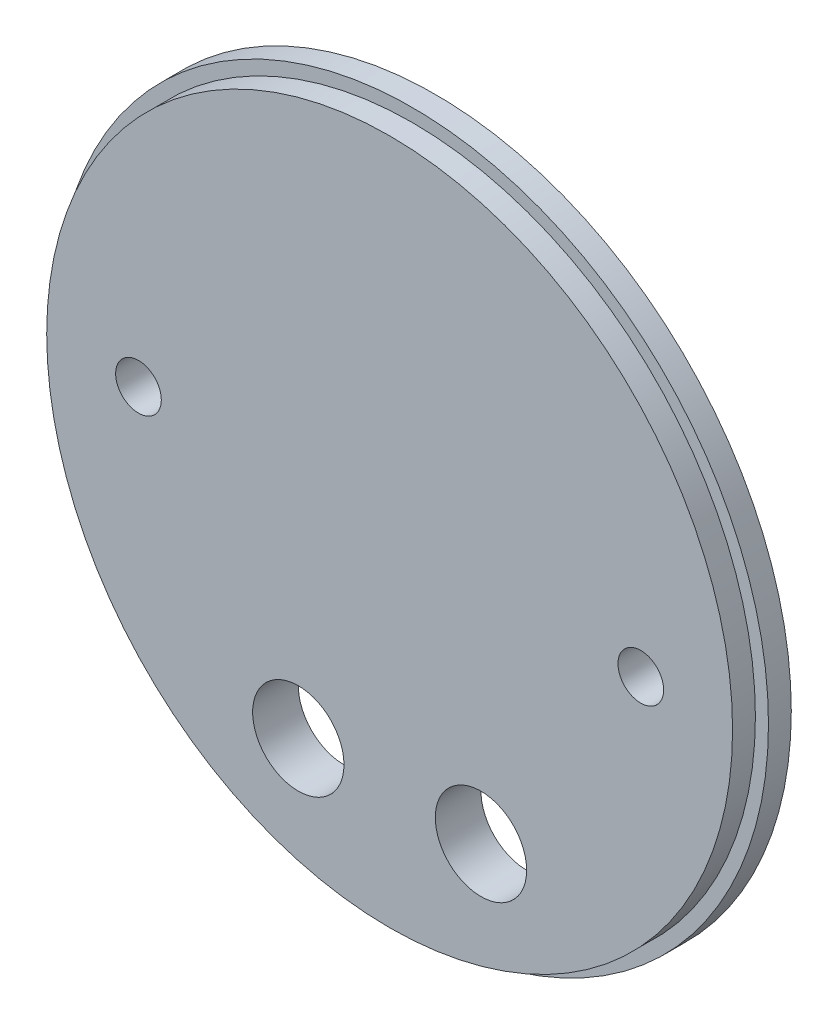
ISO-10303-21;
HEADER;
FILE_DESCRIPTION(('STEP AP214'),'2;1');
FILE_NAME('part.step','',(''),(''),'','','');
FILE_SCHEMA(('AUTOMOTIVE_DESIGN { 1 0 10303 214 1 1 1 1 }'));
ENDSEC;
DATA;
#1=APPLICATION_CONTEXT('core data for automotive mechanical design processes');
#2=APPLICATION_PROTOCOL_DEFINITION('international standard','automotive_design',2000,#1);
#3=PRODUCT_CONTEXT('',#1,'mechanical');
#4=PRODUCT('Part','Part','',(#3));
#5=PRODUCT_RELATED_PRODUCT_CATEGORY('part','',(#4));
#6=PRODUCT_DEFINITION_FORMATION('','',#4);
#7=PRODUCT_DEFINITION_CONTEXT('part definition',#1,'design');
#8=PRODUCT_DEFINITION('design','',#6,#7);
#9=PRODUCT_DEFINITION_SHAPE('','',#8);
#10=(LENGTH_UNIT() NAMED_UNIT(*) SI_UNIT(.MILLI.,.METRE.));
#11=(NAMED_UNIT(*) PLANE_ANGLE_UNIT() SI_UNIT($,.RADIAN.));
#12=(NAMED_UNIT(*) SI_UNIT($,.STERADIAN.) SOLID_ANGLE_UNIT());
#13=UNCERTAINTY_MEASURE_WITH_UNIT(LENGTH_MEASURE(1.E-05),#10,'distance_accuracy_value','');
#14=(GEOMETRIC_REPRESENTATION_CONTEXT(3) GLOBAL_UNCERTAINTY_ASSIGNED_CONTEXT((#13)) GLOBAL_UNIT_ASSIGNED_CONTEXT((#10,
#11,#12)) REPRESENTATION_CONTEXT('',''));
#15=CARTESIAN_POINT('',(0.,0.,0.));
#16=DIRECTION('',(0.,0.,1.));
#17=DIRECTION('',(1.,0.,0.));
#18=AXIS2_PLACEMENT_3D('',#15,#16,#17);
#19=CARTESIAN_POINT('',(0.,0.,3.175));
#20=DIRECTION('',(0.,0.,-1.));
#21=DIRECTION('',(-1.,0.,0.));
#22=AXIS2_PLACEMENT_3D('',#19,#20,#21);
#23=CYLINDRICAL_SURFACE('',#22,49.5046);
#24=CARTESIAN_POINT('',(0.,0.,3.175));
#25=DIRECTION('',(0.,0.,1.));
#26=DIRECTION('',(1.,0.,0.));
#27=AXIS2_PLACEMENT_3D('',#24,#25,#26);
#28=CIRCLE('',#27,49.5046);
#29=CARTESIAN_POINT('',(49.5046,0.,3.175));
#30=VERTEX_POINT('',#29);
#31=EDGE_CURVE('E42',#30,#30,#28,.T.);
#32=ORIENTED_EDGE('',*,*,#31,.F.);
#33=EDGE_LOOP('',(#32));
#34=FACE_BOUND('',#33,.T.);
#35=CARTESIAN_POINT('',(0.,0.,0.));
#36=DIRECTION('',(0.,0.,1.));
#37=DIRECTION('',(1.,0.,0.));
#38=AXIS2_PLACEMENT_3D('',#35,#36,#37);
#39=CIRCLE('',#38,49.5046);
#40=CARTESIAN_POINT('',(49.5046,0.,0.));
#41=VERTEX_POINT('',#40);
#42=EDGE_CURVE('E38',#41,#41,#39,.T.);
#43=ORIENTED_EDGE('',*,*,#42,.T.);
#44=EDGE_LOOP('',(#43));
#45=FACE_BOUND('',#44,.T.);
#46=ADVANCED_FACE('F35',(#34,#45),#23,.T.);
#47=CARTESIAN_POINT('',(0.,0.,3.175));
#48=DIRECTION('',(0.,0.,1.));
#49=DIRECTION('',(1.,0.,0.));
#50=AXIS2_PLACEMENT_3D('',#47,#48,#49);
#51=PLANE('',#50);
#52=CARTESIAN_POINT('',(0.,0.,3.175));
#53=DIRECTION('',(0.,0.,1.));
#54=DIRECTION('',(1.,0.,0.));
#55=AXIS2_PLACEMENT_3D('',#52,#53,#54);
#56=CIRCLE('',#55,47.6885);
#57=CARTESIAN_POINT('',(47.6885,0.,3.175));
#58=VERTEX_POINT('',#57);
#59=EDGE_CURVE('E10',#58,#58,#56,.T.);
#60=ORIENTED_EDGE('',*,*,#59,.F.);
#61=EDGE_LOOP('',(#60));
#62=FACE_BOUND('',#61,.T.);
#63=ORIENTED_EDGE('',*,*,#31,.T.);
#64=EDGE_LOOP('',(#63));
#65=FACE_BOUND('',#64,.T.);
#66=ADVANCED_FACE('F102',(#62,#65),#51,.T.);
#67=CARTESIAN_POINT('',(0.,0.,0.));
#68=DIRECTION('',(0.,0.,1.));
#69=DIRECTION('',(1.,0.,0.));
#70=AXIS2_PLACEMENT_3D('',#67,#68,#69);
#71=PLANE('',#70);
#72=CARTESIAN_POINT('',(34.925,0.,0.));
#73=DIRECTION('',(0.,0.,1.));
#74=DIRECTION('',(1.,0.,0.));
#75=AXIS2_PLACEMENT_3D('',#72,#73,#74);
#76=CIRCLE('',#75,3.175);
#77=CARTESIAN_POINT('',(38.1,0.,0.));
#78=VERTEX_POINT('',#77);
#79=EDGE_CURVE('E61',#78,#78,#76,.T.);
#80=ORIENTED_EDGE('',*,*,#79,.T.);
#81=EDGE_LOOP('',(#80));
#82=FACE_BOUND('',#81,.T.);
#83=CARTESIAN_POINT('',(-34.925,0.,0.));
#84=DIRECTION('',(0.,0.,1.));
#85=DIRECTION('',(1.,0.,0.));
#86=AXIS2_PLACEMENT_3D('',#83,#84,#85);
#87=CIRCLE('',#86,3.17500000000001);
#88=CARTESIAN_POINT('',(-31.75,0.,0.));
#89=VERTEX_POINT('',#88);
#90=EDGE_CURVE('E67',#89,#89,#87,.T.);
#91=ORIENTED_EDGE('',*,*,#90,.T.);
#92=EDGE_LOOP('',(#91));
#93=FACE_BOUND('',#92,.T.);
#94=CARTESIAN_POINT('',(12.7,-31.2353524431853,0.));
#95=DIRECTION('',(0.,0.,1.));
#96=DIRECTION('',(1.,0.,0.));
#97=AXIS2_PLACEMENT_3D('',#94,#95,#96);
#98=CIRCLE('',#97,6.35);
#99=CARTESIAN_POINT('',(19.05,-31.2353524431853,0.));
#100=VERTEX_POINT('',#99);
#101=EDGE_CURVE('E55',#100,#100,#98,.T.);
#102=ORIENTED_EDGE('',*,*,#101,.T.);
#103=EDGE_LOOP('',(#102));
#104=FACE_BOUND('',#103,.T.);
#105=CARTESIAN_POINT('',(-12.7,-31.2353524431853,0.));
#106=DIRECTION('',(0.,0.,1.));
#107=DIRECTION('',(1.,0.,0.));
#108=AXIS2_PLACEMENT_3D('',#105,#106,#107);
#109=CIRCLE('',#108,6.35);
#110=CARTESIAN_POINT('',(-6.35,-31.2353524431853,0.));
#111=VERTEX_POINT('',#110);
#112=EDGE_CURVE('E51',#111,#111,#109,.T.);
#113=ORIENTED_EDGE('',*,*,#112,.T.);
#114=EDGE_LOOP('',(#113));
#115=FACE_BOUND('',#114,.T.);
#116=ORIENTED_EDGE('',*,*,#42,.F.);
#117=EDGE_LOOP('',(#116));
#118=FACE_BOUND('',#117,.T.);
#119=ADVANCED_FACE('F76',(#82,#93,#104,#115,#118),#71,.F.);
#120=CARTESIAN_POINT('',(0.,0.,6.35));
#121=DIRECTION('',(0.,0.,-1.));
#122=DIRECTION('',(-1.,0.,0.));
#123=AXIS2_PLACEMENT_3D('',#120,#121,#122);
#124=CYLINDRICAL_SURFACE('',#123,47.6885);
#125=CARTESIAN_POINT('',(0.,0.,6.35));
#126=DIRECTION('',(0.,0.,1.));
#127=DIRECTION('',(1.,0.,0.));
#128=AXIS2_PLACEMENT_3D('',#125,#126,#127);
#129=CIRCLE('',#128,47.6885);
#130=CARTESIAN_POINT('',(47.6885,0.,6.35));
#131=VERTEX_POINT('',#130);
#132=EDGE_CURVE('E48',#131,#131,#129,.T.);
#133=ORIENTED_EDGE('',*,*,#132,.F.);
#134=EDGE_LOOP('',(#133));
#135=FACE_BOUND('',#134,.T.);
#136=ORIENTED_EDGE('',*,*,#59,.T.);
#137=EDGE_LOOP('',(#136));
#138=FACE_BOUND('',#137,.T.);
#139=ADVANCED_FACE('F90',(#135,#138),#124,.T.);
#140=CARTESIAN_POINT('',(0.,0.,6.35));
#141=DIRECTION('',(0.,0.,1.));
#142=DIRECTION('',(1.,0.,0.));
#143=AXIS2_PLACEMENT_3D('',#140,#141,#142);
#144=PLANE('',#143);
#145=CARTESIAN_POINT('',(34.925,0.,6.35));
#146=DIRECTION('',(0.,0.,1.));
#147=DIRECTION('',(1.,0.,0.));
#148=AXIS2_PLACEMENT_3D('',#145,#146,#147);
#149=CIRCLE('',#148,3.175);
#150=CARTESIAN_POINT('',(38.1,0.,6.35));
#151=VERTEX_POINT('',#150);
#152=EDGE_CURVE('E58',#151,#151,#149,.T.);
#153=ORIENTED_EDGE('',*,*,#152,.F.);
#154=EDGE_LOOP('',(#153));
#155=FACE_BOUND('',#154,.T.);
#156=CARTESIAN_POINT('',(-34.925,0.,6.35));
#157=DIRECTION('',(0.,0.,1.));
#158=DIRECTION('',(1.,0.,0.));
#159=AXIS2_PLACEMENT_3D('',#156,#157,#158);
#160=CIRCLE('',#159,3.17500000000001);
#161=CARTESIAN_POINT('',(-31.75,0.,6.35));
#162=VERTEX_POINT('',#161);
#163=EDGE_CURVE('E64',#162,#162,#160,.T.);
#164=ORIENTED_EDGE('',*,*,#163,.F.);
#165=EDGE_LOOP('',(#164));
#166=FACE_BOUND('',#165,.T.);
#167=CARTESIAN_POINT('',(12.7,-31.2353524431853,6.35));
#168=DIRECTION('',(0.,0.,1.));
#169=DIRECTION('',(1.,0.,0.));
#170=AXIS2_PLACEMENT_3D('',#167,#168,#169);
#171=CIRCLE('',#170,6.35);
#172=CARTESIAN_POINT('',(19.05,-31.2353524431853,6.35));
#173=VERTEX_POINT('',#172);
#174=EDGE_CURVE('E70',#173,#173,#171,.T.);
#175=ORIENTED_EDGE('',*,*,#174,.F.);
#176=EDGE_LOOP('',(#175));
#177=FACE_BOUND('',#176,.T.);
#178=CARTESIAN_POINT('',(-12.7,-31.2353524431853,6.35));
#179=DIRECTION('',(0.,0.,1.));
#180=DIRECTION('',(1.,0.,0.));
#181=AXIS2_PLACEMENT_3D('',#178,#179,#180);
#182=CIRCLE('',#181,6.35);
#183=CARTESIAN_POINT('',(-6.35,-31.2353524431853,6.35));
#184=VERTEX_POINT('',#183);
#185=EDGE_CURVE('E52',#184,#184,#182,.T.);
#186=ORIENTED_EDGE('',*,*,#185,.F.);
#187=EDGE_LOOP('',(#186));
#188=FACE_BOUND('',#187,.T.);
#189=ORIENTED_EDGE('',*,*,#132,.T.);
#190=EDGE_LOOP('',(#189));
#191=FACE_BOUND('',#190,.T.);
#192=ADVANCED_FACE('F87',(#155,#166,#177,#188,#191),#144,.T.);
#193=CARTESIAN_POINT('',(-12.7,-31.2353524431853,0.));
#194=DIRECTION('',(0.,0.,1.));
#195=DIRECTION('',(1.,0.,0.));
#196=AXIS2_PLACEMENT_3D('',#193,#194,#195);
#197=CYLINDRICAL_SURFACE('',#196,6.35);
#198=ORIENTED_EDGE('',*,*,#112,.F.);
#199=EDGE_LOOP('',(#198));
#200=FACE_BOUND('',#199,.T.);
#201=ORIENTED_EDGE('',*,*,#185,.T.);
#202=EDGE_LOOP('',(#201));
#203=FACE_BOUND('',#202,.T.);
#204=ADVANCED_FACE('F83',(#200,#203),#197,.F.);
#205=CARTESIAN_POINT('',(12.7,-31.2353524431853,0.));
#206=DIRECTION('',(0.,0.,1.));
#207=DIRECTION('',(1.,0.,0.));
#208=AXIS2_PLACEMENT_3D('',#205,#206,#207);
#209=CYLINDRICAL_SURFACE('',#208,6.35);
#210=ORIENTED_EDGE('',*,*,#101,.F.);
#211=EDGE_LOOP('',(#210));
#212=FACE_BOUND('',#211,.T.);
#213=ORIENTED_EDGE('',*,*,#174,.T.);
#214=EDGE_LOOP('',(#213));
#215=FACE_BOUND('',#214,.T.);
#216=ADVANCED_FACE('F79',(#212,#215),#209,.F.);
#217=CARTESIAN_POINT('',(-34.925,0.,0.));
#218=DIRECTION('',(0.,0.,1.));
#219=DIRECTION('',(1.,0.,0.));
#220=AXIS2_PLACEMENT_3D('',#217,#218,#219);
#221=CYLINDRICAL_SURFACE('',#220,3.17500000000001);
#222=ORIENTED_EDGE('',*,*,#90,.F.);
#223=EDGE_LOOP('',(#222));
#224=FACE_BOUND('',#223,.T.);
#225=ORIENTED_EDGE('',*,*,#163,.T.);
#226=EDGE_LOOP('',(#225));
#227=FACE_BOUND('',#226,.T.);
#228=ADVANCED_FACE('F82',(#224,#227),#221,.F.);
#229=CARTESIAN_POINT('',(34.925,0.,0.));
#230=DIRECTION('',(0.,0.,1.));
#231=DIRECTION('',(1.,0.,0.));
#232=AXIS2_PLACEMENT_3D('',#229,#230,#231);
#233=CYLINDRICAL_SURFACE('',#232,3.175);
#234=ORIENTED_EDGE('',*,*,#79,.F.);
#235=EDGE_LOOP('',(#234));
#236=FACE_BOUND('',#235,.T.);
#237=ORIENTED_EDGE('',*,*,#152,.T.);
#238=EDGE_LOOP('',(#237));
#239=FACE_BOUND('',#238,.T.);
#240=ADVANCED_FACE('F155',(#236,#239),#233,.F.);
#241=CLOSED_SHELL('',(#46,#66,#119,#139,#192,#204,#216,#228,#240));
#242=MANIFOLD_SOLID_BREP('B2',#241);
#243=ADVANCED_BREP_SHAPE_REPRESENTATION('',(#18,#242),#14);
#244=SHAPE_DEFINITION_REPRESENTATION(#9,#243);
ENDSEC;
END-ISO-10303-21;
